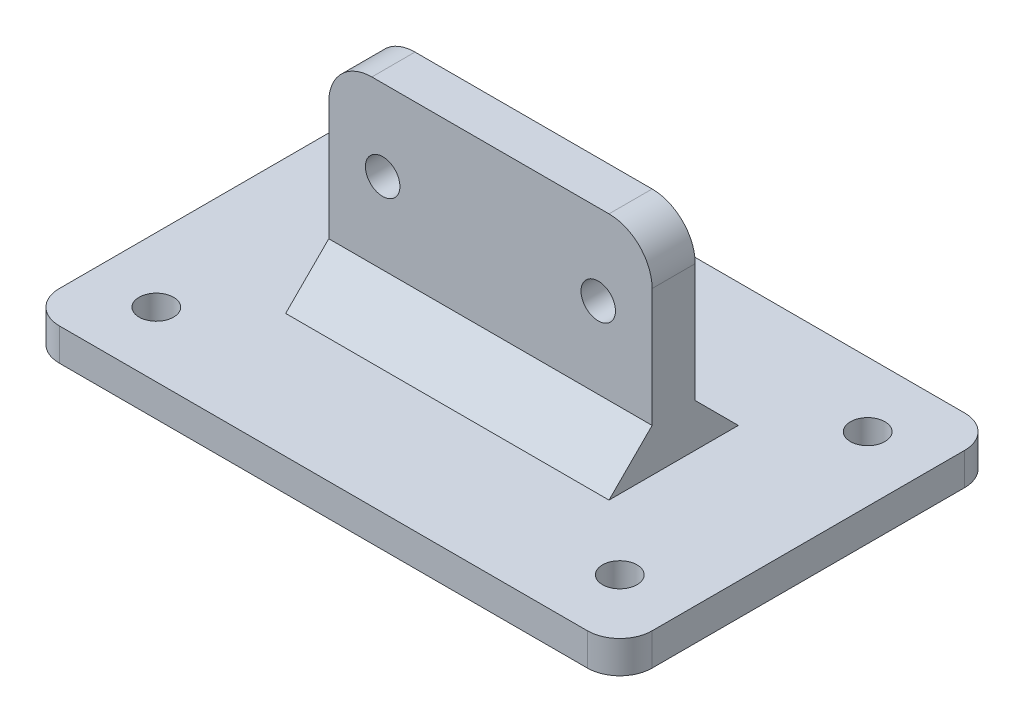
ISO-10303-21;
HEADER;
FILE_DESCRIPTION(('STEP AP214'),'2;1');
FILE_NAME('part.step','',(''),(''),'','','');
FILE_SCHEMA(('AUTOMOTIVE_DESIGN { 1 0 10303 214 1 1 1 1 }'));
ENDSEC;
DATA;
#1=APPLICATION_CONTEXT('core data for automotive mechanical design processes');
#2=APPLICATION_PROTOCOL_DEFINITION('international standard','automotive_design',2000,#1);
#3=PRODUCT_CONTEXT('',#1,'mechanical');
#4=PRODUCT('Part','Part','',(#3));
#5=PRODUCT_RELATED_PRODUCT_CATEGORY('part','',(#4));
#6=PRODUCT_DEFINITION_FORMATION('','',#4);
#7=PRODUCT_DEFINITION_CONTEXT('part definition',#1,'design');
#8=PRODUCT_DEFINITION('design','',#6,#7);
#9=PRODUCT_DEFINITION_SHAPE('','',#8);
#10=(LENGTH_UNIT() NAMED_UNIT(*) SI_UNIT(.MILLI.,.METRE.));
#11=(NAMED_UNIT(*) PLANE_ANGLE_UNIT() SI_UNIT($,.RADIAN.));
#12=(NAMED_UNIT(*) SI_UNIT($,.STERADIAN.) SOLID_ANGLE_UNIT());
#13=UNCERTAINTY_MEASURE_WITH_UNIT(LENGTH_MEASURE(1.E-05),#10,'distance_accuracy_value','');
#14=(GEOMETRIC_REPRESENTATION_CONTEXT(3) GLOBAL_UNCERTAINTY_ASSIGNED_CONTEXT((#13)) GLOBAL_UNIT_ASSIGNED_CONTEXT((#10,
#11,#12)) REPRESENTATION_CONTEXT('',''));
#15=CARTESIAN_POINT('',(0.,0.,0.));
#16=DIRECTION('',(0.,0.,1.));
#17=DIRECTION('',(1.,0.,0.));
#18=AXIS2_PLACEMENT_3D('',#15,#16,#17);
#19=CARTESIAN_POINT('',(0.,3.,0.));
#20=DIRECTION('',(0.,-1.,0.));
#21=DIRECTION('',(0.,0.,-1.));
#22=AXIS2_PLACEMENT_3D('',#19,#20,#21);
#23=PLANE('',#22);
#24=DIRECTION('',(0.,0.,-1.));
#25=VECTOR('',#24,1.);
#26=CARTESIAN_POINT('',(55.,3.,0.));
#27=LINE('',#26,#25);
#28=CARTESIAN_POINT('',(55.,3.,-3.));
#29=VERTEX_POINT('',#28);
#30=CARTESIAN_POINT('',(55.,3.,-32.));
#31=VERTEX_POINT('',#30);
#32=EDGE_CURVE('E363',#29,#31,#27,.T.);
#33=ORIENTED_EDGE('',*,*,#32,.T.);
#34=CARTESIAN_POINT('',(52.,3.,-32.));
#35=DIRECTION('',(0.,-1.,0.));
#36=DIRECTION('',(0.,0.,-1.));
#37=AXIS2_PLACEMENT_3D('',#34,#35,#36);
#38=CIRCLE('',#37,3.);
#39=CARTESIAN_POINT('',(52.,3.,-35.));
#40=VERTEX_POINT('',#39);
#41=EDGE_CURVE('E225',#31,#40,#38,.F.);
#42=ORIENTED_EDGE('',*,*,#41,.T.);
#43=DIRECTION('',(-1.,0.,0.));
#44=VECTOR('',#43,1.);
#45=CARTESIAN_POINT('',(0.,3.,-35.));
#46=LINE('',#45,#44);
#47=CARTESIAN_POINT('',(3.,3.,-35.));
#48=VERTEX_POINT('',#47);
#49=EDGE_CURVE('E182',#40,#48,#46,.T.);
#50=ORIENTED_EDGE('',*,*,#49,.T.);
#51=CARTESIAN_POINT('',(3.,3.,-32.));
#52=DIRECTION('',(0.,-1.,0.));
#53=DIRECTION('',(0.,0.,-1.));
#54=AXIS2_PLACEMENT_3D('',#51,#52,#53);
#55=CIRCLE('',#54,3.);
#56=CARTESIAN_POINT('',(0.,3.,-32.));
#57=VERTEX_POINT('',#56);
#58=EDGE_CURVE('E222',#48,#57,#55,.F.);
#59=ORIENTED_EDGE('',*,*,#58,.T.);
#60=DIRECTION('',(0.,0.,1.));
#61=VECTOR('',#60,1.);
#62=CARTESIAN_POINT('',(0.,3.,0.));
#63=LINE('',#62,#61);
#64=CARTESIAN_POINT('',(0.,3.,-3.));
#65=VERTEX_POINT('',#64);
#66=EDGE_CURVE('E190',#57,#65,#63,.T.);
#67=ORIENTED_EDGE('',*,*,#66,.T.);
#68=CARTESIAN_POINT('',(3.,3.,-3.));
#69=DIRECTION('',(0.,-1.,0.));
#70=DIRECTION('',(0.,0.,-1.));
#71=AXIS2_PLACEMENT_3D('',#68,#69,#70);
#72=CIRCLE('',#71,3.);
#73=CARTESIAN_POINT('',(3.,3.,0.));
#74=VERTEX_POINT('',#73);
#75=EDGE_CURVE('E219',#65,#74,#72,.F.);
#76=ORIENTED_EDGE('',*,*,#75,.T.);
#77=DIRECTION('',(1.,0.,0.));
#78=VECTOR('',#77,1.);
#79=CARTESIAN_POINT('',(0.,3.,0.));
#80=LINE('',#79,#78);
#81=CARTESIAN_POINT('',(52.,3.,0.));
#82=VERTEX_POINT('',#81);
#83=EDGE_CURVE('E196',#74,#82,#80,.T.);
#84=ORIENTED_EDGE('',*,*,#83,.T.);
#85=CARTESIAN_POINT('',(52.,3.,-3.));
#86=DIRECTION('',(0.,-1.,0.));
#87=DIRECTION('',(0.,0.,-1.));
#88=AXIS2_PLACEMENT_3D('',#85,#86,#87);
#89=CIRCLE('',#88,3.);
#90=EDGE_CURVE('E216',#82,#29,#89,.F.);
#91=ORIENTED_EDGE('',*,*,#90,.T.);
#92=EDGE_LOOP('',(#33,#42,#50,#59,#67,#76,#84,#91));
#93=FACE_BOUND('',#92,.T.);
#94=CARTESIAN_POINT('',(6.,3.,-29.));
#95=DIRECTION('',(0.,1.,0.));
#96=DIRECTION('',(0.,0.,1.));
#97=AXIS2_PLACEMENT_3D('',#94,#95,#96);
#98=CIRCLE('',#97,1.6);
#99=CARTESIAN_POINT('',(6.,3.,-27.4));
#100=VERTEX_POINT('',#99);
#101=EDGE_CURVE('E332',#100,#100,#98,.T.);
#102=ORIENTED_EDGE('',*,*,#101,.F.);
#103=EDGE_LOOP('',(#102));
#104=FACE_BOUND('',#103,.T.);
#105=CARTESIAN_POINT('',(49.,3.,-29.));
#106=DIRECTION('',(0.,1.,0.));
#107=DIRECTION('',(0.,0.,1.));
#108=AXIS2_PLACEMENT_3D('',#105,#106,#107);
#109=CIRCLE('',#108,1.6);
#110=CARTESIAN_POINT('',(49.,3.,-27.4));
#111=VERTEX_POINT('',#110);
#112=EDGE_CURVE('E328',#111,#111,#109,.T.);
#113=ORIENTED_EDGE('',*,*,#112,.F.);
#114=EDGE_LOOP('',(#113));
#115=FACE_BOUND('',#114,.T.);
#116=CARTESIAN_POINT('',(49.,3.,-6.));
#117=DIRECTION('',(0.,1.,0.));
#118=DIRECTION('',(0.,0.,1.));
#119=AXIS2_PLACEMENT_3D('',#116,#117,#118);
#120=CIRCLE('',#119,1.6);
#121=CARTESIAN_POINT('',(49.,3.,-4.4));
#122=VERTEX_POINT('',#121);
#123=EDGE_CURVE('E337',#122,#122,#120,.T.);
#124=ORIENTED_EDGE('',*,*,#123,.F.);
#125=EDGE_LOOP('',(#124));
#126=FACE_BOUND('',#125,.T.);
#127=CARTESIAN_POINT('',(6.,3.,-6.));
#128=DIRECTION('',(0.,1.,0.));
#129=DIRECTION('',(0.,0.,1.));
#130=AXIS2_PLACEMENT_3D('',#127,#128,#129);
#131=CIRCLE('',#130,1.6);
#132=CARTESIAN_POINT('',(6.,3.,-4.4));
#133=VERTEX_POINT('',#132);
#134=EDGE_CURVE('E345',#133,#133,#131,.T.);
#135=ORIENTED_EDGE('',*,*,#134,.F.);
#136=EDGE_LOOP('',(#135));
#137=FACE_BOUND('',#136,.T.);
#138=DIRECTION('',(0.,0.,-1.));
#139=VECTOR('',#138,1.);
#140=CARTESIAN_POINT('',(42.5,3.,-19.5));
#141=LINE('',#140,#139);
#142=CARTESIAN_POINT('',(42.5,3.,-11.5));
#143=VERTEX_POINT('',#142);
#144=CARTESIAN_POINT('',(42.5,3.,-23.5));
#145=VERTEX_POINT('',#144);
#146=EDGE_CURVE('E306',#143,#145,#141,.T.);
#147=ORIENTED_EDGE('',*,*,#146,.F.);
#148=DIRECTION('',(-1.,0.,0.));
#149=VECTOR('',#148,1.);
#150=CARTESIAN_POINT('',(12.5,3.,-11.5));
#151=LINE('',#150,#149);
#152=CARTESIAN_POINT('',(12.5,3.,-11.5));
#153=VERTEX_POINT('',#152);
#154=EDGE_CURVE('E250',#143,#153,#151,.T.);
#155=ORIENTED_EDGE('',*,*,#154,.T.);
#156=DIRECTION('',(0.,0.,1.));
#157=VECTOR('',#156,1.);
#158=CARTESIAN_POINT('',(12.5,3.,-19.5));
#159=LINE('',#158,#157);
#160=CARTESIAN_POINT('',(12.5,3.,-23.5));
#161=VERTEX_POINT('',#160);
#162=EDGE_CURVE('E438',#161,#153,#159,.T.);
#163=ORIENTED_EDGE('',*,*,#162,.F.);
#164=DIRECTION('',(1.,0.,0.));
#165=VECTOR('',#164,1.);
#166=CARTESIAN_POINT('',(42.5,3.,-23.5));
#167=LINE('',#166,#165);
#168=EDGE_CURVE('E246',#161,#145,#167,.T.);
#169=ORIENTED_EDGE('',*,*,#168,.T.);
#170=EDGE_LOOP('',(#147,#155,#163,#169));
#171=FACE_BOUND('',#170,.T.);
#172=ADVANCED_FACE('F47',(#93,#104,#115,#126,#137,#171),#23,.F.);
#173=CARTESIAN_POINT('',(0.,3.,0.));
#174=DIRECTION('',(1.,0.,0.));
#175=DIRECTION('',(0.,0.,-1.));
#176=AXIS2_PLACEMENT_3D('',#173,#174,#175);
#177=PLANE('',#176);
#178=ORIENTED_EDGE('',*,*,#66,.F.);
#179=DIRECTION('',(0.,-1.,0.));
#180=VECTOR('',#179,1.);
#181=CARTESIAN_POINT('',(0.,3.,-32.));
#182=LINE('',#181,#180);
#183=CARTESIAN_POINT('',(0.,0.,-32.));
#184=VERTEX_POINT('',#183);
#185=EDGE_CURVE('E231',#57,#184,#182,.T.);
#186=ORIENTED_EDGE('',*,*,#185,.T.);
#187=DIRECTION('',(0.,0.,1.));
#188=VECTOR('',#187,1.);
#189=CARTESIAN_POINT('',(0.,0.,0.));
#190=LINE('',#189,#188);
#191=CARTESIAN_POINT('',(0.,0.,-3.));
#192=VERTEX_POINT('',#191);
#193=EDGE_CURVE('E356',#184,#192,#190,.T.);
#194=ORIENTED_EDGE('',*,*,#193,.T.);
#195=DIRECTION('',(0.,-1.,0.));
#196=VECTOR('',#195,1.);
#197=CARTESIAN_POINT('',(0.,3.,-3.));
#198=LINE('',#197,#196);
#199=EDGE_CURVE('E228',#192,#65,#198,.F.);
#200=ORIENTED_EDGE('',*,*,#199,.T.);
#201=EDGE_LOOP('',(#178,#186,#194,#200));
#202=FACE_BOUND('',#201,.T.);
#203=ADVANCED_FACE('F395',(#202),#177,.F.);
#204=CARTESIAN_POINT('',(0.,3.,0.));
#205=DIRECTION('',(0.,0.,-1.));
#206=DIRECTION('',(-1.,0.,0.));
#207=AXIS2_PLACEMENT_3D('',#204,#205,#206);
#208=PLANE('',#207);
#209=ORIENTED_EDGE('',*,*,#83,.F.);
#210=DIRECTION('',(0.,-1.,0.));
#211=VECTOR('',#210,1.);
#212=CARTESIAN_POINT('',(3.,3.,0.));
#213=LINE('',#212,#211);
#214=CARTESIAN_POINT('',(3.,0.,0.));
#215=VERTEX_POINT('',#214);
#216=EDGE_CURVE('E238',#74,#215,#213,.T.);
#217=ORIENTED_EDGE('',*,*,#216,.T.);
#218=DIRECTION('',(1.,0.,0.));
#219=VECTOR('',#218,1.);
#220=CARTESIAN_POINT('',(0.,0.,0.));
#221=LINE('',#220,#219);
#222=CARTESIAN_POINT('',(52.,0.,0.));
#223=VERTEX_POINT('',#222);
#224=EDGE_CURVE('E198',#215,#223,#221,.T.);
#225=ORIENTED_EDGE('',*,*,#224,.T.);
#226=DIRECTION('',(0.,-1.,0.));
#227=VECTOR('',#226,1.);
#228=CARTESIAN_POINT('',(52.,3.,0.));
#229=LINE('',#228,#227);
#230=EDGE_CURVE('E235',#223,#82,#229,.F.);
#231=ORIENTED_EDGE('',*,*,#230,.T.);
#232=EDGE_LOOP('',(#209,#217,#225,#231));
#233=FACE_BOUND('',#232,.T.);
#234=ADVANCED_FACE('F377',(#233),#208,.F.);
#235=CARTESIAN_POINT('',(55.,3.,0.));
#236=DIRECTION('',(-1.,0.,0.));
#237=DIRECTION('',(0.,0.,1.));
#238=AXIS2_PLACEMENT_3D('',#235,#236,#237);
#239=PLANE('',#238);
#240=DIRECTION('',(0.,0.,-1.));
#241=VECTOR('',#240,1.);
#242=CARTESIAN_POINT('',(55.,0.,0.));
#243=LINE('',#242,#241);
#244=CARTESIAN_POINT('',(55.,0.,-3.));
#245=VERTEX_POINT('',#244);
#246=CARTESIAN_POINT('',(55.,0.,-32.));
#247=VERTEX_POINT('',#246);
#248=EDGE_CURVE('E191',#245,#247,#243,.T.);
#249=ORIENTED_EDGE('',*,*,#248,.T.);
#250=DIRECTION('',(0.,-1.,0.));
#251=VECTOR('',#250,1.);
#252=CARTESIAN_POINT('',(55.,3.,-32.));
#253=LINE('',#252,#251);
#254=EDGE_CURVE('E166',#247,#31,#253,.F.);
#255=ORIENTED_EDGE('',*,*,#254,.T.);
#256=ORIENTED_EDGE('',*,*,#32,.F.);
#257=DIRECTION('',(0.,-1.,0.));
#258=VECTOR('',#257,1.);
#259=CARTESIAN_POINT('',(55.,3.,-3.));
#260=LINE('',#259,#258);
#261=EDGE_CURVE('E172',#29,#245,#260,.T.);
#262=ORIENTED_EDGE('',*,*,#261,.T.);
#263=EDGE_LOOP('',(#249,#255,#256,#262));
#264=FACE_BOUND('',#263,.T.);
#265=ADVANCED_FACE('F387',(#264),#239,.F.);
#266=CARTESIAN_POINT('',(0.,3.,-35.));
#267=DIRECTION('',(0.,0.,1.));
#268=DIRECTION('',(1.,0.,0.));
#269=AXIS2_PLACEMENT_3D('',#266,#267,#268);
#270=PLANE('',#269);
#271=ORIENTED_EDGE('',*,*,#49,.F.);
#272=DIRECTION('',(0.,-1.,0.));
#273=VECTOR('',#272,1.);
#274=CARTESIAN_POINT('',(52.,3.,-35.));
#275=LINE('',#274,#273);
#276=CARTESIAN_POINT('',(52.,0.,-35.));
#277=VERTEX_POINT('',#276);
#278=EDGE_CURVE('E165',#40,#277,#275,.T.);
#279=ORIENTED_EDGE('',*,*,#278,.T.);
#280=DIRECTION('',(-1.,0.,0.));
#281=VECTOR('',#280,1.);
#282=CARTESIAN_POINT('',(0.,0.,-35.));
#283=LINE('',#282,#281);
#284=CARTESIAN_POINT('',(3.,0.,-35.));
#285=VERTEX_POINT('',#284);
#286=EDGE_CURVE('E179',#277,#285,#283,.T.);
#287=ORIENTED_EDGE('',*,*,#286,.T.);
#288=DIRECTION('',(0.,-1.,0.));
#289=VECTOR('',#288,1.);
#290=CARTESIAN_POINT('',(3.,3.,-35.));
#291=LINE('',#290,#289);
#292=EDGE_CURVE('E185',#285,#48,#291,.F.);
#293=ORIENTED_EDGE('',*,*,#292,.T.);
#294=EDGE_LOOP('',(#271,#279,#287,#293));
#295=FACE_BOUND('',#294,.T.);
#296=ADVANCED_FACE('F178',(#295),#270,.F.);
#297=CARTESIAN_POINT('',(0.,0.,0.));
#298=DIRECTION('',(0.,-1.,0.));
#299=DIRECTION('',(0.,0.,-1.));
#300=AXIS2_PLACEMENT_3D('',#297,#298,#299);
#301=PLANE('',#300);
#302=CARTESIAN_POINT('',(6.,0.,-6.));
#303=DIRECTION('',(0.,1.,0.));
#304=DIRECTION('',(0.,0.,1.));
#305=AXIS2_PLACEMENT_3D('',#302,#303,#304);
#306=CIRCLE('',#305,1.6);
#307=CARTESIAN_POINT('',(6.,0.,-4.4));
#308=VERTEX_POINT('',#307);
#309=EDGE_CURVE('E327',#308,#308,#306,.T.);
#310=ORIENTED_EDGE('',*,*,#309,.T.);
#311=EDGE_LOOP('',(#310));
#312=FACE_BOUND('',#311,.T.);
#313=CARTESIAN_POINT('',(49.,0.,-6.));
#314=DIRECTION('',(0.,1.,0.));
#315=DIRECTION('',(0.,0.,1.));
#316=AXIS2_PLACEMENT_3D('',#313,#314,#315);
#317=CIRCLE('',#316,1.6);
#318=CARTESIAN_POINT('',(49.,0.,-4.4));
#319=VERTEX_POINT('',#318);
#320=EDGE_CURVE('E341',#319,#319,#317,.T.);
#321=ORIENTED_EDGE('',*,*,#320,.T.);
#322=EDGE_LOOP('',(#321));
#323=FACE_BOUND('',#322,.T.);
#324=CARTESIAN_POINT('',(49.,0.,-29.));
#325=DIRECTION('',(0.,1.,0.));
#326=DIRECTION('',(0.,0.,1.));
#327=AXIS2_PLACEMENT_3D('',#324,#325,#326);
#328=CIRCLE('',#327,1.6);
#329=CARTESIAN_POINT('',(49.,0.,-27.4));
#330=VERTEX_POINT('',#329);
#331=EDGE_CURVE('E333',#330,#330,#328,.T.);
#332=ORIENTED_EDGE('',*,*,#331,.T.);
#333=EDGE_LOOP('',(#332));
#334=FACE_BOUND('',#333,.T.);
#335=CARTESIAN_POINT('',(6.,0.,-29.));
#336=DIRECTION('',(0.,1.,0.));
#337=DIRECTION('',(0.,0.,1.));
#338=AXIS2_PLACEMENT_3D('',#335,#336,#337);
#339=CIRCLE('',#338,1.6);
#340=CARTESIAN_POINT('',(6.,0.,-27.4));
#341=VERTEX_POINT('',#340);
#342=EDGE_CURVE('E352',#341,#341,#339,.T.);
#343=ORIENTED_EDGE('',*,*,#342,.T.);
#344=EDGE_LOOP('',(#343));
#345=FACE_BOUND('',#344,.T.);
#346=ORIENTED_EDGE('',*,*,#286,.F.);
#347=CARTESIAN_POINT('',(52.,0.,-32.));
#348=DIRECTION('',(0.,-1.,0.));
#349=DIRECTION('',(0.,0.,-1.));
#350=AXIS2_PLACEMENT_3D('',#347,#348,#349);
#351=CIRCLE('',#350,3.);
#352=EDGE_CURVE('E161',#277,#247,#351,.T.);
#353=ORIENTED_EDGE('',*,*,#352,.T.);
#354=ORIENTED_EDGE('',*,*,#248,.F.);
#355=CARTESIAN_POINT('',(52.,0.,-3.));
#356=DIRECTION('',(0.,-1.,0.));
#357=DIRECTION('',(0.,0.,-1.));
#358=AXIS2_PLACEMENT_3D('',#355,#356,#357);
#359=CIRCLE('',#358,3.);
#360=EDGE_CURVE('E184',#245,#223,#359,.T.);
#361=ORIENTED_EDGE('',*,*,#360,.T.);
#362=ORIENTED_EDGE('',*,*,#224,.F.);
#363=CARTESIAN_POINT('',(3.,0.,-3.));
#364=DIRECTION('',(0.,-1.,0.));
#365=DIRECTION('',(0.,0.,-1.));
#366=AXIS2_PLACEMENT_3D('',#363,#364,#365);
#367=CIRCLE('',#366,3.);
#368=EDGE_CURVE('E206',#215,#192,#367,.T.);
#369=ORIENTED_EDGE('',*,*,#368,.T.);
#370=ORIENTED_EDGE('',*,*,#193,.F.);
#371=CARTESIAN_POINT('',(3.,0.,-32.));
#372=DIRECTION('',(0.,-1.,0.));
#373=DIRECTION('',(0.,0.,-1.));
#374=AXIS2_PLACEMENT_3D('',#371,#372,#373);
#375=CIRCLE('',#374,3.);
#376=EDGE_CURVE('E173',#184,#285,#375,.T.);
#377=ORIENTED_EDGE('',*,*,#376,.T.);
#378=EDGE_LOOP('',(#346,#353,#354,#361,#362,#369,#370,#377));
#379=FACE_BOUND('',#378,.T.);
#380=ADVANCED_FACE('F187',(#312,#323,#334,#345,#379),#301,.T.);
#381=CARTESIAN_POINT('',(6.,0.,-29.));
#382=DIRECTION('',(0.,1.,0.));
#383=DIRECTION('',(0.,0.,1.));
#384=AXIS2_PLACEMENT_3D('',#381,#382,#383);
#385=CYLINDRICAL_SURFACE('',#384,1.6);
#386=ORIENTED_EDGE('',*,*,#342,.F.);
#387=EDGE_LOOP('',(#386));
#388=FACE_BOUND('',#387,.T.);
#389=ORIENTED_EDGE('',*,*,#101,.T.);
#390=EDGE_LOOP('',(#389));
#391=FACE_BOUND('',#390,.T.);
#392=ADVANCED_FACE('F408',(#388,#391),#385,.F.);
#393=CARTESIAN_POINT('',(49.,0.,-29.));
#394=DIRECTION('',(0.,1.,0.));
#395=DIRECTION('',(0.,0.,1.));
#396=AXIS2_PLACEMENT_3D('',#393,#394,#395);
#397=CYLINDRICAL_SURFACE('',#396,1.6);
#398=ORIENTED_EDGE('',*,*,#331,.F.);
#399=EDGE_LOOP('',(#398));
#400=FACE_BOUND('',#399,.T.);
#401=ORIENTED_EDGE('',*,*,#112,.T.);
#402=EDGE_LOOP('',(#401));
#403=FACE_BOUND('',#402,.T.);
#404=ADVANCED_FACE('F416',(#400,#403),#397,.F.);
#405=CARTESIAN_POINT('',(49.,0.,-6.));
#406=DIRECTION('',(0.,1.,0.));
#407=DIRECTION('',(0.,0.,1.));
#408=AXIS2_PLACEMENT_3D('',#405,#406,#407);
#409=CYLINDRICAL_SURFACE('',#408,1.6);
#410=ORIENTED_EDGE('',*,*,#320,.F.);
#411=EDGE_LOOP('',(#410));
#412=FACE_BOUND('',#411,.T.);
#413=ORIENTED_EDGE('',*,*,#123,.T.);
#414=EDGE_LOOP('',(#413));
#415=FACE_BOUND('',#414,.T.);
#416=ADVANCED_FACE('F496',(#412,#415),#409,.F.);
#417=CARTESIAN_POINT('',(6.,0.,-6.));
#418=DIRECTION('',(0.,1.,0.));
#419=DIRECTION('',(0.,0.,1.));
#420=AXIS2_PLACEMENT_3D('',#417,#418,#419);
#421=CYLINDRICAL_SURFACE('',#420,1.6);
#422=ORIENTED_EDGE('',*,*,#309,.F.);
#423=EDGE_LOOP('',(#422));
#424=FACE_BOUND('',#423,.T.);
#425=ORIENTED_EDGE('',*,*,#134,.T.);
#426=EDGE_LOOP('',(#425));
#427=FACE_BOUND('',#426,.T.);
#428=ADVANCED_FACE('F499',(#424,#427),#421,.F.);
#429=CARTESIAN_POINT('',(52.,3.,-32.));
#430=DIRECTION('',(0.,-1.,0.));
#431=DIRECTION('',(0.,0.,-1.));
#432=AXIS2_PLACEMENT_3D('',#429,#430,#431);
#433=CYLINDRICAL_SURFACE('',#432,3.);
#434=ORIENTED_EDGE('',*,*,#41,.F.);
#435=ORIENTED_EDGE('',*,*,#254,.F.);
#436=ORIENTED_EDGE('',*,*,#352,.F.);
#437=ORIENTED_EDGE('',*,*,#278,.F.);
#438=EDGE_LOOP('',(#434,#435,#436,#437));
#439=FACE_BOUND('',#438,.T.);
#440=ADVANCED_FACE('F164',(#439),#433,.T.);
#441=CARTESIAN_POINT('',(3.,3.,-32.));
#442=DIRECTION('',(0.,-1.,0.));
#443=DIRECTION('',(0.,0.,-1.));
#444=AXIS2_PLACEMENT_3D('',#441,#442,#443);
#445=CYLINDRICAL_SURFACE('',#444,3.);
#446=ORIENTED_EDGE('',*,*,#58,.F.);
#447=ORIENTED_EDGE('',*,*,#292,.F.);
#448=ORIENTED_EDGE('',*,*,#376,.F.);
#449=ORIENTED_EDGE('',*,*,#185,.F.);
#450=EDGE_LOOP('',(#446,#447,#448,#449));
#451=FACE_BOUND('',#450,.T.);
#452=ADVANCED_FACE('F505',(#451),#445,.T.);
#453=CARTESIAN_POINT('',(3.,3.,-3.));
#454=DIRECTION('',(0.,-1.,0.));
#455=DIRECTION('',(0.,0.,-1.));
#456=AXIS2_PLACEMENT_3D('',#453,#454,#455);
#457=CYLINDRICAL_SURFACE('',#456,3.);
#458=ORIENTED_EDGE('',*,*,#75,.F.);
#459=ORIENTED_EDGE('',*,*,#199,.F.);
#460=ORIENTED_EDGE('',*,*,#368,.F.);
#461=ORIENTED_EDGE('',*,*,#216,.F.);
#462=EDGE_LOOP('',(#458,#459,#460,#461));
#463=FACE_BOUND('',#462,.T.);
#464=ADVANCED_FACE('F511',(#463),#457,.T.);
#465=CARTESIAN_POINT('',(52.,3.,-3.));
#466=DIRECTION('',(0.,-1.,0.));
#467=DIRECTION('',(0.,0.,-1.));
#468=AXIS2_PLACEMENT_3D('',#465,#466,#467);
#469=CYLINDRICAL_SURFACE('',#468,3.);
#470=ORIENTED_EDGE('',*,*,#90,.F.);
#471=ORIENTED_EDGE('',*,*,#230,.F.);
#472=ORIENTED_EDGE('',*,*,#360,.F.);
#473=ORIENTED_EDGE('',*,*,#261,.F.);
#474=EDGE_LOOP('',(#470,#471,#472,#473));
#475=FACE_BOUND('',#474,.T.);
#476=ADVANCED_FACE('F381',(#475),#469,.T.);
#477=CARTESIAN_POINT('',(12.5,22.,-19.5));
#478=DIRECTION('',(1.,0.,0.));
#479=DIRECTION('',(0.,0.,-1.));
#480=AXIS2_PLACEMENT_3D('',#477,#478,#479);
#481=PLANE('',#480);
#482=DIRECTION('',(0.,-1.,0.));
#483=VECTOR('',#482,1.);
#484=CARTESIAN_POINT('',(12.5,22.,-15.5));
#485=LINE('',#484,#483);
#486=CARTESIAN_POINT('',(12.5,18.,-15.5));
#487=VERTEX_POINT('',#486);
#488=CARTESIAN_POINT('',(12.5,7.00000000000002,-15.5));
#489=VERTEX_POINT('',#488);
#490=EDGE_CURVE('E320',#487,#489,#485,.T.);
#491=ORIENTED_EDGE('',*,*,#490,.F.);
#492=DIRECTION('',(0.,0.,1.));
#493=VECTOR('',#492,1.);
#494=CARTESIAN_POINT('',(12.5,18.,-19.5));
#495=LINE('',#494,#493);
#496=CARTESIAN_POINT('',(12.5,18.,-19.5));
#497=VERTEX_POINT('',#496);
#498=EDGE_CURVE('E11',#487,#497,#495,.F.);
#499=ORIENTED_EDGE('',*,*,#498,.T.);
#500=DIRECTION('',(0.,-1.,0.));
#501=VECTOR('',#500,1.);
#502=CARTESIAN_POINT('',(12.5,22.,-19.5));
#503=LINE('',#502,#501);
#504=CARTESIAN_POINT('',(12.5,7.00000000000003,-19.5));
#505=VERTEX_POINT('',#504);
#506=EDGE_CURVE('E316',#497,#505,#503,.T.);
#507=ORIENTED_EDGE('',*,*,#506,.T.);
#508=DIRECTION('',(0.,0.707106781186551,0.707106781186545));
#509=VECTOR('',#508,1.);
#510=CARTESIAN_POINT('',(12.5,14.5000000000001,-12.));
#511=LINE('',#510,#509);
#512=EDGE_CURVE('E266',#505,#161,#511,.F.);
#513=ORIENTED_EDGE('',*,*,#512,.T.);
#514=ORIENTED_EDGE('',*,*,#162,.T.);
#515=DIRECTION('',(0.,-0.707106781186551,0.707106781186544));
#516=VECTOR('',#515,1.);
#517=CARTESIAN_POINT('',(12.5,16.5000000000001,-25.));
#518=LINE('',#517,#516);
#519=EDGE_CURVE('E262',#153,#489,#518,.F.);
#520=ORIENTED_EDGE('',*,*,#519,.T.);
#521=EDGE_LOOP('',(#491,#499,#507,#513,#514,#520));
#522=FACE_BOUND('',#521,.T.);
#523=ADVANCED_FACE('F444',(#522),#481,.F.);
#524=CARTESIAN_POINT('',(12.5,22.,-15.5));
#525=DIRECTION('',(0.,0.,-1.));
#526=DIRECTION('',(-1.,0.,0.));
#527=AXIS2_PLACEMENT_3D('',#524,#525,#526);
#528=PLANE('',#527);
#529=CARTESIAN_POINT('',(37.5,14.5,-15.5));
#530=DIRECTION('',(0.,0.,-1.));
#531=DIRECTION('',(-1.,0.,0.));
#532=AXIS2_PLACEMENT_3D('',#529,#530,#531);
#533=CIRCLE('',#532,1.6);
#534=CARTESIAN_POINT('',(35.9,14.5,-15.5));
#535=VERTEX_POINT('',#534);
#536=EDGE_CURVE('E448',#535,#535,#533,.T.);
#537=ORIENTED_EDGE('',*,*,#536,.T.);
#538=EDGE_LOOP('',(#537));
#539=FACE_BOUND('',#538,.T.);
#540=CARTESIAN_POINT('',(17.5,14.5,-15.5));
#541=DIRECTION('',(0.,0.,-1.));
#542=DIRECTION('',(-1.,0.,0.));
#543=AXIS2_PLACEMENT_3D('',#540,#541,#542);
#544=CIRCLE('',#543,1.6);
#545=CARTESIAN_POINT('',(15.9,14.5,-15.5));
#546=VERTEX_POINT('',#545);
#547=EDGE_CURVE('E452',#546,#546,#544,.T.);
#548=ORIENTED_EDGE('',*,*,#547,.T.);
#549=EDGE_LOOP('',(#548));
#550=FACE_BOUND('',#549,.T.);
#551=DIRECTION('',(0.,-1.,0.));
#552=VECTOR('',#551,1.);
#553=CARTESIAN_POINT('',(42.5,22.,-15.5));
#554=LINE('',#553,#552);
#555=CARTESIAN_POINT('',(42.5,18.,-15.5));
#556=VERTEX_POINT('',#555);
#557=CARTESIAN_POINT('',(42.5,7.00000000000002,-15.5));
#558=VERTEX_POINT('',#557);
#559=EDGE_CURVE('E296',#556,#558,#554,.T.);
#560=ORIENTED_EDGE('',*,*,#559,.F.);
#561=CARTESIAN_POINT('',(38.5,18.,-15.5));
#562=DIRECTION('',(0.,0.,-1.));
#563=DIRECTION('',(-1.,0.,0.));
#564=AXIS2_PLACEMENT_3D('',#561,#562,#563);
#565=CIRCLE('',#564,4.);
#566=CARTESIAN_POINT('',(38.5,22.,-15.5));
#567=VERTEX_POINT('',#566);
#568=EDGE_CURVE('E56',#556,#567,#565,.F.);
#569=ORIENTED_EDGE('',*,*,#568,.T.);
#570=DIRECTION('',(1.,0.,0.));
#571=VECTOR('',#570,1.);
#572=CARTESIAN_POINT('',(12.5,22.,-15.5));
#573=LINE('',#572,#571);
#574=CARTESIAN_POINT('',(16.5,22.,-15.5));
#575=VERTEX_POINT('',#574);
#576=EDGE_CURVE('E295',#575,#567,#573,.T.);
#577=ORIENTED_EDGE('',*,*,#576,.F.);
#578=CARTESIAN_POINT('',(16.5,18.,-15.5));
#579=DIRECTION('',(0.,0.,-1.));
#580=DIRECTION('',(-1.,0.,0.));
#581=AXIS2_PLACEMENT_3D('',#578,#579,#580);
#582=CIRCLE('',#581,4.);
#583=EDGE_CURVE('E63',#575,#487,#582,.F.);
#584=ORIENTED_EDGE('',*,*,#583,.T.);
#585=ORIENTED_EDGE('',*,*,#490,.T.);
#586=DIRECTION('',(1.,0.,0.));
#587=VECTOR('',#586,1.);
#588=CARTESIAN_POINT('',(42.5,7.00000000000002,-15.5));
#589=LINE('',#588,#587);
#590=EDGE_CURVE('E242',#489,#558,#589,.T.);
#591=ORIENTED_EDGE('',*,*,#590,.T.);
#592=EDGE_LOOP('',(#560,#569,#577,#584,#585,#591));
#593=FACE_BOUND('',#592,.T.);
#594=ADVANCED_FACE('F294',(#539,#550,#593),#528,.F.);
#595=CARTESIAN_POINT('',(42.5,22.,-19.5));
#596=DIRECTION('',(-1.,0.,0.));
#597=DIRECTION('',(0.,0.,1.));
#598=AXIS2_PLACEMENT_3D('',#595,#596,#597);
#599=PLANE('',#598);
#600=DIRECTION('',(0.,-1.,0.));
#601=VECTOR('',#600,1.);
#602=CARTESIAN_POINT('',(42.5,22.,-19.5));
#603=LINE('',#602,#601);
#604=CARTESIAN_POINT('',(42.5,18.,-19.5));
#605=VERTEX_POINT('',#604);
#606=CARTESIAN_POINT('',(42.5,7.00000000000003,-19.5));
#607=VERTEX_POINT('',#606);
#608=EDGE_CURVE('E311',#605,#607,#603,.T.);
#609=ORIENTED_EDGE('',*,*,#608,.F.);
#610=DIRECTION('',(0.,0.,-1.));
#611=VECTOR('',#610,1.);
#612=CARTESIAN_POINT('',(42.5,18.,-15.5));
#613=LINE('',#612,#611);
#614=EDGE_CURVE('E71',#605,#556,#613,.F.);
#615=ORIENTED_EDGE('',*,*,#614,.T.);
#616=ORIENTED_EDGE('',*,*,#559,.T.);
#617=DIRECTION('',(0.,0.707106781186551,-0.707106781186544));
#618=VECTOR('',#617,1.);
#619=CARTESIAN_POINT('',(42.5,16.5000000000001,-25.));
#620=LINE('',#619,#618);
#621=EDGE_CURVE('E258',#558,#143,#620,.F.);
#622=ORIENTED_EDGE('',*,*,#621,.T.);
#623=ORIENTED_EDGE('',*,*,#146,.T.);
#624=DIRECTION('',(0.,-0.707106781186551,-0.707106781186545));
#625=VECTOR('',#624,1.);
#626=CARTESIAN_POINT('',(42.5,14.5000000000001,-12.));
#627=LINE('',#626,#625);
#628=EDGE_CURVE('E270',#145,#607,#627,.F.);
#629=ORIENTED_EDGE('',*,*,#628,.T.);
#630=EDGE_LOOP('',(#609,#615,#616,#622,#623,#629));
#631=FACE_BOUND('',#630,.T.);
#632=ADVANCED_FACE('F312',(#631),#599,.F.);
#633=CARTESIAN_POINT('',(12.5,22.,-19.5));
#634=DIRECTION('',(0.,0.,1.));
#635=DIRECTION('',(1.,0.,0.));
#636=AXIS2_PLACEMENT_3D('',#633,#634,#635);
#637=PLANE('',#636);
#638=CARTESIAN_POINT('',(37.5,14.5,-19.5));
#639=DIRECTION('',(0.,0.,-1.));
#640=DIRECTION('',(-1.,0.,0.));
#641=AXIS2_PLACEMENT_3D('',#638,#639,#640);
#642=CIRCLE('',#641,1.6);
#643=CARTESIAN_POINT('',(35.9,14.5,-19.5));
#644=VERTEX_POINT('',#643);
#645=EDGE_CURVE('E460',#644,#644,#642,.T.);
#646=ORIENTED_EDGE('',*,*,#645,.F.);
#647=EDGE_LOOP('',(#646));
#648=FACE_BOUND('',#647,.T.);
#649=CARTESIAN_POINT('',(17.5,14.5,-19.5));
#650=DIRECTION('',(0.,0.,-1.));
#651=DIRECTION('',(-1.,0.,0.));
#652=AXIS2_PLACEMENT_3D('',#649,#650,#651);
#653=CIRCLE('',#652,1.6);
#654=CARTESIAN_POINT('',(15.9,14.5,-19.5));
#655=VERTEX_POINT('',#654);
#656=EDGE_CURVE('E461',#655,#655,#653,.T.);
#657=ORIENTED_EDGE('',*,*,#656,.F.);
#658=EDGE_LOOP('',(#657));
#659=FACE_BOUND('',#658,.T.);
#660=DIRECTION('',(-1.,0.,0.));
#661=VECTOR('',#660,1.);
#662=CARTESIAN_POINT('',(12.5,22.,-19.5));
#663=LINE('',#662,#661);
#664=CARTESIAN_POINT('',(38.5,22.,-19.5));
#665=VERTEX_POINT('',#664);
#666=CARTESIAN_POINT('',(16.5,22.,-19.5));
#667=VERTEX_POINT('',#666);
#668=EDGE_CURVE('E305',#665,#667,#663,.T.);
#669=ORIENTED_EDGE('',*,*,#668,.F.);
#670=CARTESIAN_POINT('',(38.5,18.,-19.5));
#671=DIRECTION('',(0.,0.,1.));
#672=DIRECTION('',(1.,0.,0.));
#673=AXIS2_PLACEMENT_3D('',#670,#671,#672);
#674=CIRCLE('',#673,4.);
#675=EDGE_CURVE('E285',#665,#605,#674,.F.);
#676=ORIENTED_EDGE('',*,*,#675,.T.);
#677=ORIENTED_EDGE('',*,*,#608,.T.);
#678=DIRECTION('',(-1.,0.,0.));
#679=VECTOR('',#678,1.);
#680=CARTESIAN_POINT('',(12.5,7.00000000000003,-19.5));
#681=LINE('',#680,#679);
#682=EDGE_CURVE('E254',#607,#505,#681,.T.);
#683=ORIENTED_EDGE('',*,*,#682,.T.);
#684=ORIENTED_EDGE('',*,*,#506,.F.);
#685=CARTESIAN_POINT('',(16.5,18.,-19.5));
#686=DIRECTION('',(0.,0.,1.));
#687=DIRECTION('',(1.,0.,0.));
#688=AXIS2_PLACEMENT_3D('',#685,#686,#687);
#689=CIRCLE('',#688,4.);
#690=EDGE_CURVE('E282',#497,#667,#689,.F.);
#691=ORIENTED_EDGE('',*,*,#690,.T.);
#692=EDGE_LOOP('',(#669,#676,#677,#683,#684,#691));
#693=FACE_BOUND('',#692,.T.);
#694=ADVANCED_FACE('F310',(#648,#659,#693),#637,.F.);
#695=CARTESIAN_POINT('',(0.,22.,0.));
#696=DIRECTION('',(0.,1.,0.));
#697=DIRECTION('',(0.,0.,1.));
#698=AXIS2_PLACEMENT_3D('',#695,#696,#697);
#699=PLANE('',#698);
#700=ORIENTED_EDGE('',*,*,#576,.T.);
#701=DIRECTION('',(0.,0.,-1.));
#702=VECTOR('',#701,1.);
#703=CARTESIAN_POINT('',(38.5,22.,-19.5));
#704=LINE('',#703,#702);
#705=EDGE_CURVE('E278',#567,#665,#704,.T.);
#706=ORIENTED_EDGE('',*,*,#705,.T.);
#707=ORIENTED_EDGE('',*,*,#668,.T.);
#708=DIRECTION('',(0.,0.,1.));
#709=VECTOR('',#708,1.);
#710=CARTESIAN_POINT('',(16.5,22.,-15.5));
#711=LINE('',#710,#709);
#712=EDGE_CURVE('E274',#667,#575,#711,.T.);
#713=ORIENTED_EDGE('',*,*,#712,.T.);
#714=EDGE_LOOP('',(#700,#706,#707,#713));
#715=FACE_BOUND('',#714,.T.);
#716=ADVANCED_FACE('F300',(#715),#699,.T.);
#717=CARTESIAN_POINT('',(12.5,7.00000000000002,-15.5));
#718=DIRECTION('',(0.,0.707106781186544,0.707106781186551));
#719=DIRECTION('',(-1.,0.,0.));
#720=AXIS2_PLACEMENT_3D('',#717,#718,#719);
#721=PLANE('',#720);
#722=ORIENTED_EDGE('',*,*,#519,.F.);
#723=ORIENTED_EDGE('',*,*,#154,.F.);
#724=ORIENTED_EDGE('',*,*,#621,.F.);
#725=ORIENTED_EDGE('',*,*,#590,.F.);
#726=EDGE_LOOP('',(#722,#723,#724,#725));
#727=FACE_BOUND('',#726,.T.);
#728=ADVANCED_FACE('F442',(#727),#721,.T.);
#729=CARTESIAN_POINT('',(12.5,7.00000000000003,-19.5));
#730=DIRECTION('',(0.,0.707106781186545,-0.707106781186551));
#731=DIRECTION('',(1.,0.,0.));
#732=AXIS2_PLACEMENT_3D('',#729,#730,#731);
#733=PLANE('',#732);
#734=ORIENTED_EDGE('',*,*,#628,.F.);
#735=ORIENTED_EDGE('',*,*,#168,.F.);
#736=ORIENTED_EDGE('',*,*,#512,.F.);
#737=ORIENTED_EDGE('',*,*,#682,.F.);
#738=EDGE_LOOP('',(#734,#735,#736,#737));
#739=FACE_BOUND('',#738,.T.);
#740=ADVANCED_FACE('F480',(#739),#733,.T.);
#741=CARTESIAN_POINT('',(17.5,14.5,-0.500000000000004));
#742=DIRECTION('',(0.,0.,-1.));
#743=DIRECTION('',(-1.,0.,0.));
#744=AXIS2_PLACEMENT_3D('',#741,#742,#743);
#745=CYLINDRICAL_SURFACE('',#744,1.6);
#746=ORIENTED_EDGE('',*,*,#656,.T.);
#747=EDGE_LOOP('',(#746));
#748=FACE_BOUND('',#747,.T.);
#749=ORIENTED_EDGE('',*,*,#547,.F.);
#750=EDGE_LOOP('',(#749));
#751=FACE_BOUND('',#750,.T.);
#752=ADVANCED_FACE('F477',(#748,#751),#745,.F.);
#753=CARTESIAN_POINT('',(37.5,14.5,-0.500000000000004));
#754=DIRECTION('',(0.,0.,-1.));
#755=DIRECTION('',(-1.,0.,0.));
#756=AXIS2_PLACEMENT_3D('',#753,#754,#755);
#757=CYLINDRICAL_SURFACE('',#756,1.6);
#758=ORIENTED_EDGE('',*,*,#645,.T.);
#759=EDGE_LOOP('',(#758));
#760=FACE_BOUND('',#759,.T.);
#761=ORIENTED_EDGE('',*,*,#536,.F.);
#762=EDGE_LOOP('',(#761));
#763=FACE_BOUND('',#762,.T.);
#764=ADVANCED_FACE('F469',(#760,#763),#757,.F.);
#765=CARTESIAN_POINT('',(38.5,18.,0.));
#766=DIRECTION('',(0.,0.,1.));
#767=DIRECTION('',(1.,0.,0.));
#768=AXIS2_PLACEMENT_3D('',#765,#766,#767);
#769=CYLINDRICAL_SURFACE('',#768,4.);
#770=ORIENTED_EDGE('',*,*,#568,.F.);
#771=ORIENTED_EDGE('',*,*,#614,.F.);
#772=ORIENTED_EDGE('',*,*,#675,.F.);
#773=ORIENTED_EDGE('',*,*,#705,.F.);
#774=EDGE_LOOP('',(#770,#771,#772,#773));
#775=FACE_BOUND('',#774,.T.);
#776=ADVANCED_FACE('F308',(#775),#769,.T.);
#777=CARTESIAN_POINT('',(16.5,18.,0.));
#778=DIRECTION('',(0.,0.,-1.));
#779=DIRECTION('',(-1.,0.,0.));
#780=AXIS2_PLACEMENT_3D('',#777,#778,#779);
#781=CYLINDRICAL_SURFACE('',#780,4.);
#782=ORIENTED_EDGE('',*,*,#690,.F.);
#783=ORIENTED_EDGE('',*,*,#498,.F.);
#784=ORIENTED_EDGE('',*,*,#583,.F.);
#785=ORIENTED_EDGE('',*,*,#712,.F.);
#786=EDGE_LOOP('',(#782,#783,#784,#785));
#787=FACE_BOUND('',#786,.T.);
#788=ADVANCED_FACE('F49',(#787),#781,.T.);
#789=CLOSED_SHELL('',(#172,#203,#234,#265,#296,#380,#392,#404,#416,#428,#440,#452,#464,#476,
#523,#594,#632,#694,#716,#728,#740,#752,#764,#776,#788));
#790=MANIFOLD_SOLID_BREP('B2',#789);
#791=ADVANCED_BREP_SHAPE_REPRESENTATION('',(#18,#790),#14);
#792=SHAPE_DEFINITION_REPRESENTATION(#9,#791);
ENDSEC;
END-ISO-10303-21;
